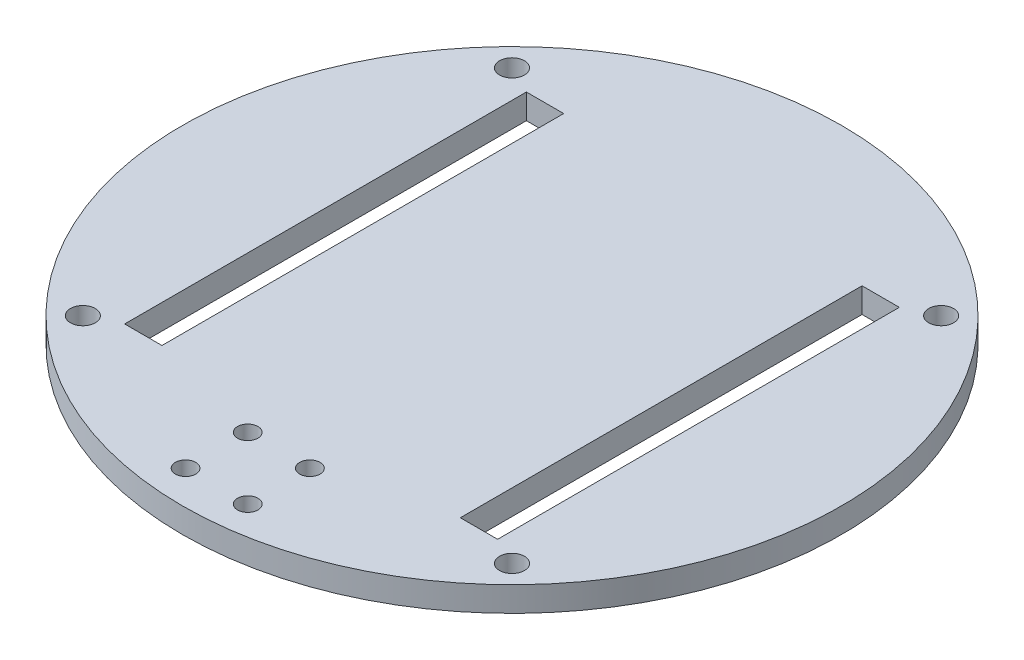
ISO-10303-21;
HEADER;
FILE_DESCRIPTION(('STEP AP214'),'2;1');
FILE_NAME('part.step','',(''),(''),'','','');
FILE_SCHEMA(('AUTOMOTIVE_DESIGN { 1 0 10303 214 1 1 1 1 }'));
ENDSEC;
DATA;
#1=APPLICATION_CONTEXT('core data for automotive mechanical design processes');
#2=APPLICATION_PROTOCOL_DEFINITION('international standard','automotive_design',2000,#1);
#3=PRODUCT_CONTEXT('',#1,'mechanical');
#4=PRODUCT('Part','Part','',(#3));
#5=PRODUCT_RELATED_PRODUCT_CATEGORY('part','',(#4));
#6=PRODUCT_DEFINITION_FORMATION('','',#4);
#7=PRODUCT_DEFINITION_CONTEXT('part definition',#1,'design');
#8=PRODUCT_DEFINITION('design','',#6,#7);
#9=PRODUCT_DEFINITION_SHAPE('','',#8);
#10=(LENGTH_UNIT() NAMED_UNIT(*) SI_UNIT(.MILLI.,.METRE.));
#11=(NAMED_UNIT(*) PLANE_ANGLE_UNIT() SI_UNIT($,.RADIAN.));
#12=(NAMED_UNIT(*) SI_UNIT($,.STERADIAN.) SOLID_ANGLE_UNIT());
#13=UNCERTAINTY_MEASURE_WITH_UNIT(LENGTH_MEASURE(1.E-05),#10,'distance_accuracy_value','');
#14=(GEOMETRIC_REPRESENTATION_CONTEXT(3) GLOBAL_UNCERTAINTY_ASSIGNED_CONTEXT((#13)) GLOBAL_UNIT_ASSIGNED_CONTEXT((#10,
#11,#12)) REPRESENTATION_CONTEXT('',''));
#15=CARTESIAN_POINT('',(0.,0.,0.));
#16=DIRECTION('',(0.,0.,1.));
#17=DIRECTION('',(1.,0.,0.));
#18=AXIS2_PLACEMENT_3D('',#15,#16,#17);
#19=CARTESIAN_POINT('',(-47.625,73.15,0.));
#20=DIRECTION('',(1.,0.,0.));
#21=DIRECTION('',(0.,0.,-1.));
#22=AXIS2_PLACEMENT_3D('',#19,#20,#21);
#23=PLANE('',#22);
#24=DIRECTION('',(0.,0.,1.));
#25=VECTOR('',#24,1.);
#26=CARTESIAN_POINT('',(-47.625,66.8,0.));
#27=LINE('',#26,#25);
#28=CARTESIAN_POINT('',(-47.625,66.8,-51.3016508018992));
#29=VERTEX_POINT('',#28);
#30=CARTESIAN_POINT('',(-47.625,66.8,51.3016508018992));
#31=VERTEX_POINT('',#30);
#32=EDGE_CURVE('E179',#29,#31,#27,.T.);
#33=ORIENTED_EDGE('',*,*,#32,.F.);
#34=DIRECTION('',(0.,-1.,0.));
#35=VECTOR('',#34,1.);
#36=CARTESIAN_POINT('',(-47.625,73.15,-51.3016508018992));
#37=LINE('',#36,#35);
#38=CARTESIAN_POINT('',(-47.625,73.15,-51.3016508018992));
#39=VERTEX_POINT('',#38);
#40=EDGE_CURVE('E11',#39,#29,#37,.T.);
#41=ORIENTED_EDGE('',*,*,#40,.F.);
#42=DIRECTION('',(0.,0.,1.));
#43=VECTOR('',#42,1.);
#44=CARTESIAN_POINT('',(-47.625,73.15,0.));
#45=LINE('',#44,#43);
#46=CARTESIAN_POINT('',(-47.625,73.15,51.3016508018992));
#47=VERTEX_POINT('',#46);
#48=EDGE_CURVE('E124',#39,#47,#45,.T.);
#49=ORIENTED_EDGE('',*,*,#48,.T.);
#50=DIRECTION('',(0.,-1.,0.));
#51=VECTOR('',#50,1.);
#52=CARTESIAN_POINT('',(-47.625,73.15,51.3016508018992));
#53=LINE('',#52,#51);
#54=EDGE_CURVE('E88',#47,#31,#53,.T.);
#55=ORIENTED_EDGE('',*,*,#54,.T.);
#56=EDGE_LOOP('',(#33,#41,#49,#55));
#57=FACE_BOUND('',#56,.T.);
#58=ADVANCED_FACE('F35',(#57),#23,.T.);
#59=CARTESIAN_POINT('',(0.,73.15,-51.3016508018992));
#60=DIRECTION('',(0.,0.,-1.));
#61=DIRECTION('',(-1.,0.,0.));
#62=AXIS2_PLACEMENT_3D('',#59,#60,#61);
#63=PLANE('',#62);
#64=DIRECTION('',(1.,0.,0.));
#65=VECTOR('',#64,1.);
#66=CARTESIAN_POINT('',(0.,66.8,-51.3016508018992));
#67=LINE('',#66,#65);
#68=CARTESIAN_POINT('',(-38.1,66.8,-51.3016508018992));
#69=VERTEX_POINT('',#68);
#70=EDGE_CURVE('E129',#29,#69,#67,.T.);
#71=ORIENTED_EDGE('',*,*,#70,.T.);
#72=DIRECTION('',(0.,-1.,0.));
#73=VECTOR('',#72,1.);
#74=CARTESIAN_POINT('',(-38.1,73.15,-51.3016508018992));
#75=LINE('',#74,#73);
#76=CARTESIAN_POINT('',(-38.1,73.15,-51.3016508018992));
#77=VERTEX_POINT('',#76);
#78=EDGE_CURVE('E45',#77,#69,#75,.T.);
#79=ORIENTED_EDGE('',*,*,#78,.F.);
#80=DIRECTION('',(1.,0.,0.));
#81=VECTOR('',#80,1.);
#82=CARTESIAN_POINT('',(0.,73.15,-51.3016508018992));
#83=LINE('',#82,#81);
#84=EDGE_CURVE('E119',#39,#77,#83,.T.);
#85=ORIENTED_EDGE('',*,*,#84,.F.);
#86=ORIENTED_EDGE('',*,*,#40,.T.);
#87=EDGE_LOOP('',(#71,#79,#85,#86));
#88=FACE_BOUND('',#87,.T.);
#89=ADVANCED_FACE('F127',(#88),#63,.F.);
#90=CARTESIAN_POINT('',(-38.1,73.15,0.));
#91=DIRECTION('',(1.,0.,0.));
#92=DIRECTION('',(0.,0.,-1.));
#93=AXIS2_PLACEMENT_3D('',#90,#91,#92);
#94=PLANE('',#93);
#95=DIRECTION('',(0.,0.,1.));
#96=VECTOR('',#95,1.);
#97=CARTESIAN_POINT('',(-38.1,66.8,0.));
#98=LINE('',#97,#96);
#99=CARTESIAN_POINT('',(-38.1,66.8,51.3016508018992));
#100=VERTEX_POINT('',#99);
#101=EDGE_CURVE('E176',#69,#100,#98,.T.);
#102=ORIENTED_EDGE('',*,*,#101,.T.);
#103=DIRECTION('',(0.,-1.,0.));
#104=VECTOR('',#103,1.);
#105=CARTESIAN_POINT('',(-38.1,73.15,51.3016508018992));
#106=LINE('',#105,#104);
#107=CARTESIAN_POINT('',(-38.1,73.15,51.3016508018992));
#108=VERTEX_POINT('',#107);
#109=EDGE_CURVE('E118',#108,#100,#106,.T.);
#110=ORIENTED_EDGE('',*,*,#109,.F.);
#111=DIRECTION('',(0.,0.,1.));
#112=VECTOR('',#111,1.);
#113=CARTESIAN_POINT('',(-38.1,73.15,0.));
#114=LINE('',#113,#112);
#115=EDGE_CURVE('E112',#77,#108,#114,.T.);
#116=ORIENTED_EDGE('',*,*,#115,.F.);
#117=ORIENTED_EDGE('',*,*,#78,.T.);
#118=EDGE_LOOP('',(#102,#110,#116,#117));
#119=FACE_BOUND('',#118,.T.);
#120=ADVANCED_FACE('F115',(#119),#94,.F.);
#121=CARTESIAN_POINT('',(0.,73.15,-51.3016508018992));
#122=DIRECTION('',(0.,0.,-1.));
#123=DIRECTION('',(-1.,0.,0.));
#124=AXIS2_PLACEMENT_3D('',#121,#122,#123);
#125=PLANE('',#124);
#126=DIRECTION('',(1.,0.,0.));
#127=VECTOR('',#126,1.);
#128=CARTESIAN_POINT('',(0.,66.8,-51.3016508018992));
#129=LINE('',#128,#127);
#130=CARTESIAN_POINT('',(38.1,66.8,-51.3016508018992));
#131=VERTEX_POINT('',#130);
#132=CARTESIAN_POINT('',(47.625,66.8,-51.3016508018992));
#133=VERTEX_POINT('',#132);
#134=EDGE_CURVE('E188',#131,#133,#129,.T.);
#135=ORIENTED_EDGE('',*,*,#134,.T.);
#136=DIRECTION('',(0.,-1.,0.));
#137=VECTOR('',#136,1.);
#138=CARTESIAN_POINT('',(47.625,73.15,-51.3016508018992));
#139=LINE('',#138,#137);
#140=CARTESIAN_POINT('',(47.625,73.15,-51.3016508018992));
#141=VERTEX_POINT('',#140);
#142=EDGE_CURVE('E39',#141,#133,#139,.T.);
#143=ORIENTED_EDGE('',*,*,#142,.F.);
#144=DIRECTION('',(1.,0.,0.));
#145=VECTOR('',#144,1.);
#146=CARTESIAN_POINT('',(0.,73.15,-51.3016508018992));
#147=LINE('',#146,#145);
#148=CARTESIAN_POINT('',(38.1,73.15,-51.3016508018992));
#149=VERTEX_POINT('',#148);
#150=EDGE_CURVE('E150',#149,#141,#147,.T.);
#151=ORIENTED_EDGE('',*,*,#150,.F.);
#152=DIRECTION('',(0.,-1.,0.));
#153=VECTOR('',#152,1.);
#154=CARTESIAN_POINT('',(38.1,73.15,-51.3016508018992));
#155=LINE('',#154,#153);
#156=EDGE_CURVE('E134',#149,#131,#155,.T.);
#157=ORIENTED_EDGE('',*,*,#156,.T.);
#158=EDGE_LOOP('',(#135,#143,#151,#157));
#159=FACE_BOUND('',#158,.T.);
#160=ADVANCED_FACE('F37',(#159),#125,.F.);
#161=CARTESIAN_POINT('',(47.625,73.15,0.));
#162=DIRECTION('',(1.,0.,0.));
#163=DIRECTION('',(0.,0.,-1.));
#164=AXIS2_PLACEMENT_3D('',#161,#162,#163);
#165=PLANE('',#164);
#166=DIRECTION('',(0.,0.,1.));
#167=VECTOR('',#166,1.);
#168=CARTESIAN_POINT('',(47.625,66.8,0.));
#169=LINE('',#168,#167);
#170=CARTESIAN_POINT('',(47.625,66.8,51.3016508018992));
#171=VERTEX_POINT('',#170);
#172=EDGE_CURVE('E186',#133,#171,#169,.T.);
#173=ORIENTED_EDGE('',*,*,#172,.T.);
#174=DIRECTION('',(0.,-1.,0.));
#175=VECTOR('',#174,1.);
#176=CARTESIAN_POINT('',(47.625,73.15,51.3016508018992));
#177=LINE('',#176,#175);
#178=CARTESIAN_POINT('',(47.625,73.15,51.3016508018992));
#179=VERTEX_POINT('',#178);
#180=EDGE_CURVE('E138',#179,#171,#177,.T.);
#181=ORIENTED_EDGE('',*,*,#180,.F.);
#182=DIRECTION('',(0.,0.,1.));
#183=VECTOR('',#182,1.);
#184=CARTESIAN_POINT('',(47.625,73.15,0.));
#185=LINE('',#184,#183);
#186=EDGE_CURVE('E96',#141,#179,#185,.T.);
#187=ORIENTED_EDGE('',*,*,#186,.F.);
#188=ORIENTED_EDGE('',*,*,#142,.T.);
#189=EDGE_LOOP('',(#173,#181,#187,#188));
#190=FACE_BOUND('',#189,.T.);
#191=ADVANCED_FACE('F238',(#190),#165,.F.);
#192=CARTESIAN_POINT('',(0.,73.15,51.3016508018992));
#193=DIRECTION('',(0.,0.,1.));
#194=DIRECTION('',(1.,0.,0.));
#195=AXIS2_PLACEMENT_3D('',#192,#193,#194);
#196=PLANE('',#195);
#197=DIRECTION('',(-1.,0.,0.));
#198=VECTOR('',#197,1.);
#199=CARTESIAN_POINT('',(0.,66.8,51.3016508018992));
#200=LINE('',#199,#198);
#201=CARTESIAN_POINT('',(38.1,66.8,51.3016508018992));
#202=VERTEX_POINT('',#201);
#203=EDGE_CURVE('E184',#171,#202,#200,.T.);
#204=ORIENTED_EDGE('',*,*,#203,.T.);
#205=DIRECTION('',(0.,-1.,0.));
#206=VECTOR('',#205,1.);
#207=CARTESIAN_POINT('',(38.1,73.15,51.3016508018992));
#208=LINE('',#207,#206);
#209=CARTESIAN_POINT('',(38.1,73.15,51.3016508018992));
#210=VERTEX_POINT('',#209);
#211=EDGE_CURVE('E136',#210,#202,#208,.T.);
#212=ORIENTED_EDGE('',*,*,#211,.F.);
#213=DIRECTION('',(-1.,0.,0.));
#214=VECTOR('',#213,1.);
#215=CARTESIAN_POINT('',(0.,73.15,51.3016508018992));
#216=LINE('',#215,#214);
#217=EDGE_CURVE('E221',#179,#210,#216,.T.);
#218=ORIENTED_EDGE('',*,*,#217,.F.);
#219=ORIENTED_EDGE('',*,*,#180,.T.);
#220=EDGE_LOOP('',(#204,#212,#218,#219));
#221=FACE_BOUND('',#220,.T.);
#222=ADVANCED_FACE('F235',(#221),#196,.F.);
#223=CARTESIAN_POINT('',(7.9375,73.15,59.5566508018992));
#224=DIRECTION('',(0.,-1.,0.));
#225=DIRECTION('',(0.,0.,-1.));
#226=AXIS2_PLACEMENT_3D('',#223,#224,#225);
#227=CYLINDRICAL_SURFACE('',#226,2.6035);
#228=CARTESIAN_POINT('',(7.9375,73.15,59.5566508018992));
#229=DIRECTION('',(0.,1.,0.));
#230=DIRECTION('',(0.,0.,1.));
#231=AXIS2_PLACEMENT_3D('',#228,#229,#230);
#232=CIRCLE('',#231,2.6035);
#233=CARTESIAN_POINT('',(7.9375,73.15,62.1601508018992));
#234=VERTEX_POINT('',#233);
#235=EDGE_CURVE('E192',#234,#234,#232,.T.);
#236=ORIENTED_EDGE('',*,*,#235,.T.);
#237=EDGE_LOOP('',(#236));
#238=FACE_BOUND('',#237,.T.);
#239=CARTESIAN_POINT('',(7.9375,66.8,59.5566508018992));
#240=DIRECTION('',(0.,1.,0.));
#241=DIRECTION('',(0.,0.,1.));
#242=AXIS2_PLACEMENT_3D('',#239,#240,#241);
#243=CIRCLE('',#242,2.6035);
#244=CARTESIAN_POINT('',(7.9375,66.8,62.1601508018992));
#245=VERTEX_POINT('',#244);
#246=EDGE_CURVE('E151',#245,#245,#243,.T.);
#247=ORIENTED_EDGE('',*,*,#246,.F.);
#248=EDGE_LOOP('',(#247));
#249=FACE_BOUND('',#248,.T.);
#250=ADVANCED_FACE('F237',(#238,#249),#227,.F.);
#251=CARTESIAN_POINT('',(-54.8007755419572,73.15,-54.8007755419577));
#252=DIRECTION('',(0.,-1.,0.));
#253=DIRECTION('',(0.,0.,-1.));
#254=AXIS2_PLACEMENT_3D('',#251,#252,#253);
#255=CYLINDRICAL_SURFACE('',#254,3.175);
#256=CARTESIAN_POINT('',(-54.8007755419572,73.15,-54.8007755419577));
#257=DIRECTION('',(0.,1.,0.));
#258=DIRECTION('',(0.,0.,1.));
#259=AXIS2_PLACEMENT_3D('',#256,#257,#258);
#260=CIRCLE('',#259,3.175);
#261=CARTESIAN_POINT('',(-54.8007755419572,73.15,-51.6257755419577));
#262=VERTEX_POINT('',#261);
#263=EDGE_CURVE('E195',#262,#262,#260,.F.);
#264=ORIENTED_EDGE('',*,*,#263,.F.);
#265=EDGE_LOOP('',(#264));
#266=FACE_BOUND('',#265,.T.);
#267=CARTESIAN_POINT('',(-54.8007755419572,66.8,-54.8007755419577));
#268=DIRECTION('',(0.,1.,0.));
#269=DIRECTION('',(0.,0.,1.));
#270=AXIS2_PLACEMENT_3D('',#267,#268,#269);
#271=CIRCLE('',#270,3.175);
#272=CARTESIAN_POINT('',(-54.8007755419572,66.8,-51.6257755419577));
#273=VERTEX_POINT('',#272);
#274=EDGE_CURVE('E154',#273,#273,#271,.F.);
#275=ORIENTED_EDGE('',*,*,#274,.T.);
#276=EDGE_LOOP('',(#275));
#277=FACE_BOUND('',#276,.T.);
#278=ADVANCED_FACE('F244',(#266,#277),#255,.F.);
#279=CARTESIAN_POINT('',(54.8007755419572,73.15,54.8007755419577));
#280=DIRECTION('',(0.,-1.,0.));
#281=DIRECTION('',(0.,0.,-1.));
#282=AXIS2_PLACEMENT_3D('',#279,#280,#281);
#283=CYLINDRICAL_SURFACE('',#282,3.17499999999999);
#284=CARTESIAN_POINT('',(54.8007755419572,73.15,54.8007755419577));
#285=DIRECTION('',(0.,1.,0.));
#286=DIRECTION('',(0.,0.,1.));
#287=AXIS2_PLACEMENT_3D('',#284,#285,#286);
#288=CIRCLE('',#287,3.17499999999999);
#289=CARTESIAN_POINT('',(54.8007755419572,73.15,57.9757755419577));
#290=VERTEX_POINT('',#289);
#291=EDGE_CURVE('E198',#290,#290,#288,.F.);
#292=ORIENTED_EDGE('',*,*,#291,.F.);
#293=EDGE_LOOP('',(#292));
#294=FACE_BOUND('',#293,.T.);
#295=CARTESIAN_POINT('',(54.8007755419572,66.8,54.8007755419577));
#296=DIRECTION('',(0.,1.,0.));
#297=DIRECTION('',(0.,0.,1.));
#298=AXIS2_PLACEMENT_3D('',#295,#296,#297);
#299=CIRCLE('',#298,3.17499999999999);
#300=CARTESIAN_POINT('',(54.8007755419572,66.8,57.9757755419577));
#301=VERTEX_POINT('',#300);
#302=EDGE_CURVE('E157',#301,#301,#299,.F.);
#303=ORIENTED_EDGE('',*,*,#302,.T.);
#304=EDGE_LOOP('',(#303));
#305=FACE_BOUND('',#304,.T.);
#306=ADVANCED_FACE('F304',(#294,#305),#283,.F.);
#307=CARTESIAN_POINT('',(0.,73.15,0.));
#308=DIRECTION('',(0.,-1.,0.));
#309=DIRECTION('',(0.,0.,-1.));
#310=AXIS2_PLACEMENT_3D('',#307,#308,#309);
#311=CYLINDRICAL_SURFACE('',#310,84.1675);
#312=CARTESIAN_POINT('',(0.,73.15,0.));
#313=DIRECTION('',(0.,1.,0.));
#314=DIRECTION('',(0.,0.,1.));
#315=AXIS2_PLACEMENT_3D('',#312,#313,#314);
#316=CIRCLE('',#315,84.1675);
#317=CARTESIAN_POINT('',(0.,73.15,84.1675));
#318=VERTEX_POINT('',#317);
#319=EDGE_CURVE('E201',#318,#318,#316,.T.);
#320=ORIENTED_EDGE('',*,*,#319,.F.);
#321=EDGE_LOOP('',(#320));
#322=FACE_BOUND('',#321,.T.);
#323=CARTESIAN_POINT('',(0.,66.8,0.));
#324=DIRECTION('',(0.,1.,0.));
#325=DIRECTION('',(0.,0.,1.));
#326=AXIS2_PLACEMENT_3D('',#323,#324,#325);
#327=CIRCLE('',#326,84.1675);
#328=CARTESIAN_POINT('',(0.,66.8,84.1675));
#329=VERTEX_POINT('',#328);
#330=EDGE_CURVE('E160',#329,#329,#327,.T.);
#331=ORIENTED_EDGE('',*,*,#330,.T.);
#332=EDGE_LOOP('',(#331));
#333=FACE_BOUND('',#332,.T.);
#334=ADVANCED_FACE('F315',(#322,#333),#311,.T.);
#335=CARTESIAN_POINT('',(54.8007755419577,73.15,-54.8007755419572));
#336=DIRECTION('',(0.,-1.,0.));
#337=DIRECTION('',(0.,0.,-1.));
#338=AXIS2_PLACEMENT_3D('',#335,#336,#337);
#339=CYLINDRICAL_SURFACE('',#338,3.175);
#340=CARTESIAN_POINT('',(54.8007755419577,73.15,-54.8007755419572));
#341=DIRECTION('',(0.,1.,0.));
#342=DIRECTION('',(0.,0.,1.));
#343=AXIS2_PLACEMENT_3D('',#340,#341,#342);
#344=CIRCLE('',#343,3.175);
#345=CARTESIAN_POINT('',(54.8007755419577,73.15,-51.6257755419572));
#346=VERTEX_POINT('',#345);
#347=EDGE_CURVE('E204',#346,#346,#344,.F.);
#348=ORIENTED_EDGE('',*,*,#347,.F.);
#349=EDGE_LOOP('',(#348));
#350=FACE_BOUND('',#349,.T.);
#351=CARTESIAN_POINT('',(54.8007755419577,66.8,-54.8007755419572));
#352=DIRECTION('',(0.,1.,0.));
#353=DIRECTION('',(0.,0.,1.));
#354=AXIS2_PLACEMENT_3D('',#351,#352,#353);
#355=CIRCLE('',#354,3.175);
#356=CARTESIAN_POINT('',(54.8007755419577,66.8,-51.6257755419572));
#357=VERTEX_POINT('',#356);
#358=EDGE_CURVE('E163',#357,#357,#355,.F.);
#359=ORIENTED_EDGE('',*,*,#358,.T.);
#360=EDGE_LOOP('',(#359));
#361=FACE_BOUND('',#360,.T.);
#362=ADVANCED_FACE('F326',(#350,#361),#339,.F.);
#363=CARTESIAN_POINT('',(-54.8007755419577,73.15,54.8007755419572));
#364=DIRECTION('',(0.,-1.,0.));
#365=DIRECTION('',(0.,0.,-1.));
#366=AXIS2_PLACEMENT_3D('',#363,#364,#365);
#367=CYLINDRICAL_SURFACE('',#366,3.175);
#368=CARTESIAN_POINT('',(-54.8007755419577,73.15,54.8007755419572));
#369=DIRECTION('',(0.,1.,0.));
#370=DIRECTION('',(0.,0.,1.));
#371=AXIS2_PLACEMENT_3D('',#368,#369,#370);
#372=CIRCLE('',#371,3.175);
#373=CARTESIAN_POINT('',(-54.8007755419577,73.15,57.9757755419572));
#374=VERTEX_POINT('',#373);
#375=EDGE_CURVE('E207',#374,#374,#372,.F.);
#376=ORIENTED_EDGE('',*,*,#375,.F.);
#377=EDGE_LOOP('',(#376));
#378=FACE_BOUND('',#377,.T.);
#379=CARTESIAN_POINT('',(-54.8007755419577,66.8,54.8007755419572));
#380=DIRECTION('',(0.,1.,0.));
#381=DIRECTION('',(0.,0.,1.));
#382=AXIS2_PLACEMENT_3D('',#379,#380,#381);
#383=CIRCLE('',#382,3.175);
#384=CARTESIAN_POINT('',(-54.8007755419577,66.8,57.9757755419572));
#385=VERTEX_POINT('',#384);
#386=EDGE_CURVE('E166',#385,#385,#383,.F.);
#387=ORIENTED_EDGE('',*,*,#386,.T.);
#388=EDGE_LOOP('',(#387));
#389=FACE_BOUND('',#388,.T.);
#390=ADVANCED_FACE('F337',(#378,#389),#367,.F.);
#391=CARTESIAN_POINT('',(7.9375,73.15,75.4316508018992));
#392=DIRECTION('',(0.,-1.,0.));
#393=DIRECTION('',(0.,0.,-1.));
#394=AXIS2_PLACEMENT_3D('',#391,#392,#393);
#395=CYLINDRICAL_SURFACE('',#394,2.6035);
#396=CARTESIAN_POINT('',(7.9375,73.15,75.4316508018992));
#397=DIRECTION('',(0.,1.,0.));
#398=DIRECTION('',(0.,0.,1.));
#399=AXIS2_PLACEMENT_3D('',#396,#397,#398);
#400=CIRCLE('',#399,2.6035);
#401=CARTESIAN_POINT('',(7.9375,73.15,78.0351508018992));
#402=VERTEX_POINT('',#401);
#403=EDGE_CURVE('E210',#402,#402,#400,.T.);
#404=ORIENTED_EDGE('',*,*,#403,.T.);
#405=EDGE_LOOP('',(#404));
#406=FACE_BOUND('',#405,.T.);
#407=CARTESIAN_POINT('',(7.9375,66.8,75.4316508018992));
#408=DIRECTION('',(0.,1.,0.));
#409=DIRECTION('',(0.,0.,1.));
#410=AXIS2_PLACEMENT_3D('',#407,#408,#409);
#411=CIRCLE('',#410,2.6035);
#412=CARTESIAN_POINT('',(7.9375,66.8,78.0351508018992));
#413=VERTEX_POINT('',#412);
#414=EDGE_CURVE('E169',#413,#413,#411,.T.);
#415=ORIENTED_EDGE('',*,*,#414,.F.);
#416=EDGE_LOOP('',(#415));
#417=FACE_BOUND('',#416,.T.);
#418=ADVANCED_FACE('F270',(#406,#417),#395,.F.);
#419=CARTESIAN_POINT('',(-7.9375,73.15,75.4316508018992));
#420=DIRECTION('',(0.,-1.,0.));
#421=DIRECTION('',(0.,0.,-1.));
#422=AXIS2_PLACEMENT_3D('',#419,#420,#421);
#423=CYLINDRICAL_SURFACE('',#422,2.6035);
#424=CARTESIAN_POINT('',(-7.9375,73.15,75.4316508018992));
#425=DIRECTION('',(0.,1.,0.));
#426=DIRECTION('',(0.,0.,1.));
#427=AXIS2_PLACEMENT_3D('',#424,#425,#426);
#428=CIRCLE('',#427,2.6035);
#429=CARTESIAN_POINT('',(-7.9375,73.15,78.0351508018992));
#430=VERTEX_POINT('',#429);
#431=EDGE_CURVE('E213',#430,#430,#428,.T.);
#432=ORIENTED_EDGE('',*,*,#431,.T.);
#433=EDGE_LOOP('',(#432));
#434=FACE_BOUND('',#433,.T.);
#435=CARTESIAN_POINT('',(-7.9375,66.8,75.4316508018992));
#436=DIRECTION('',(0.,1.,0.));
#437=DIRECTION('',(0.,0.,1.));
#438=AXIS2_PLACEMENT_3D('',#435,#436,#437);
#439=CIRCLE('',#438,2.6035);
#440=CARTESIAN_POINT('',(-7.9375,66.8,78.0351508018992));
#441=VERTEX_POINT('',#440);
#442=EDGE_CURVE('E172',#441,#441,#439,.T.);
#443=ORIENTED_EDGE('',*,*,#442,.F.);
#444=EDGE_LOOP('',(#443));
#445=FACE_BOUND('',#444,.T.);
#446=ADVANCED_FACE('F264',(#434,#445),#423,.F.);
#447=CARTESIAN_POINT('',(0.,73.15,51.3016508018992));
#448=DIRECTION('',(0.,0.,1.));
#449=DIRECTION('',(1.,0.,0.));
#450=AXIS2_PLACEMENT_3D('',#447,#448,#449);
#451=PLANE('',#450);
#452=DIRECTION('',(-1.,0.,0.));
#453=VECTOR('',#452,1.);
#454=CARTESIAN_POINT('',(0.,66.8,51.3016508018992));
#455=LINE('',#454,#453);
#456=EDGE_CURVE('E81',#100,#31,#455,.T.);
#457=ORIENTED_EDGE('',*,*,#456,.T.);
#458=ORIENTED_EDGE('',*,*,#54,.F.);
#459=DIRECTION('',(-1.,0.,0.));
#460=VECTOR('',#459,1.);
#461=CARTESIAN_POINT('',(0.,73.15,51.3016508018992));
#462=LINE('',#461,#460);
#463=EDGE_CURVE('E54',#108,#47,#462,.T.);
#464=ORIENTED_EDGE('',*,*,#463,.F.);
#465=ORIENTED_EDGE('',*,*,#109,.T.);
#466=EDGE_LOOP('',(#457,#458,#464,#465));
#467=FACE_BOUND('',#466,.T.);
#468=ADVANCED_FACE('F257',(#467),#451,.F.);
#469=CARTESIAN_POINT('',(38.1,73.15,0.));
#470=DIRECTION('',(1.,0.,0.));
#471=DIRECTION('',(0.,0.,-1.));
#472=AXIS2_PLACEMENT_3D('',#469,#470,#471);
#473=PLANE('',#472);
#474=DIRECTION('',(0.,0.,1.));
#475=VECTOR('',#474,1.);
#476=CARTESIAN_POINT('',(38.1,66.8,0.));
#477=LINE('',#476,#475);
#478=EDGE_CURVE('E181',#131,#202,#477,.T.);
#479=ORIENTED_EDGE('',*,*,#478,.F.);
#480=ORIENTED_EDGE('',*,*,#156,.F.);
#481=DIRECTION('',(0.,0.,1.));
#482=VECTOR('',#481,1.);
#483=CARTESIAN_POINT('',(38.1,73.15,0.));
#484=LINE('',#483,#482);
#485=EDGE_CURVE('E218',#149,#210,#484,.T.);
#486=ORIENTED_EDGE('',*,*,#485,.T.);
#487=ORIENTED_EDGE('',*,*,#211,.T.);
#488=EDGE_LOOP('',(#479,#480,#486,#487));
#489=FACE_BOUND('',#488,.T.);
#490=ADVANCED_FACE('F233',(#489),#473,.T.);
#491=CARTESIAN_POINT('',(-7.9375,73.15,59.5566508018992));
#492=DIRECTION('',(0.,-1.,0.));
#493=DIRECTION('',(0.,0.,-1.));
#494=AXIS2_PLACEMENT_3D('',#491,#492,#493);
#495=CYLINDRICAL_SURFACE('',#494,2.6035);
#496=CARTESIAN_POINT('',(-7.9375,73.15,59.5566508018992));
#497=DIRECTION('',(0.,1.,0.));
#498=DIRECTION('',(0.,0.,1.));
#499=AXIS2_PLACEMENT_3D('',#496,#497,#498);
#500=CIRCLE('',#499,2.6035);
#501=CARTESIAN_POINT('',(-7.9375,73.15,62.1601508018992));
#502=VERTEX_POINT('',#501);
#503=EDGE_CURVE('E137',#502,#502,#500,.T.);
#504=ORIENTED_EDGE('',*,*,#503,.T.);
#505=EDGE_LOOP('',(#504));
#506=FACE_BOUND('',#505,.T.);
#507=CARTESIAN_POINT('',(-7.9375,66.8,59.5566508018992));
#508=DIRECTION('',(0.,1.,0.));
#509=DIRECTION('',(0.,0.,1.));
#510=AXIS2_PLACEMENT_3D('',#507,#508,#509);
#511=CIRCLE('',#510,2.6035);
#512=CARTESIAN_POINT('',(-7.9375,66.8,62.1601508018992));
#513=VERTEX_POINT('',#512);
#514=EDGE_CURVE('E147',#513,#513,#511,.T.);
#515=ORIENTED_EDGE('',*,*,#514,.F.);
#516=EDGE_LOOP('',(#515));
#517=FACE_BOUND('',#516,.T.);
#518=ADVANCED_FACE('F256',(#506,#517),#495,.F.);
#519=CARTESIAN_POINT('',(0.,73.15,0.));
#520=DIRECTION('',(0.,1.,0.));
#521=DIRECTION('',(0.,0.,1.));
#522=AXIS2_PLACEMENT_3D('',#519,#520,#521);
#523=PLANE('',#522);
#524=ORIENTED_EDGE('',*,*,#150,.T.);
#525=ORIENTED_EDGE('',*,*,#186,.T.);
#526=ORIENTED_EDGE('',*,*,#217,.T.);
#527=ORIENTED_EDGE('',*,*,#485,.F.);
#528=EDGE_LOOP('',(#524,#525,#526,#527));
#529=FACE_BOUND('',#528,.T.);
#530=ORIENTED_EDGE('',*,*,#48,.F.);
#531=ORIENTED_EDGE('',*,*,#84,.T.);
#532=ORIENTED_EDGE('',*,*,#115,.T.);
#533=ORIENTED_EDGE('',*,*,#463,.T.);
#534=EDGE_LOOP('',(#530,#531,#532,#533));
#535=FACE_BOUND('',#534,.T.);
#536=ORIENTED_EDGE('',*,*,#431,.F.);
#537=EDGE_LOOP('',(#536));
#538=FACE_BOUND('',#537,.T.);
#539=ORIENTED_EDGE('',*,*,#403,.F.);
#540=EDGE_LOOP('',(#539));
#541=FACE_BOUND('',#540,.T.);
#542=ORIENTED_EDGE('',*,*,#375,.T.);
#543=EDGE_LOOP('',(#542));
#544=FACE_BOUND('',#543,.T.);
#545=ORIENTED_EDGE('',*,*,#347,.T.);
#546=EDGE_LOOP('',(#545));
#547=FACE_BOUND('',#546,.T.);
#548=ORIENTED_EDGE('',*,*,#319,.T.);
#549=EDGE_LOOP('',(#548));
#550=FACE_BOUND('',#549,.T.);
#551=ORIENTED_EDGE('',*,*,#291,.T.);
#552=EDGE_LOOP('',(#551));
#553=FACE_BOUND('',#552,.T.);
#554=ORIENTED_EDGE('',*,*,#263,.T.);
#555=EDGE_LOOP('',(#554));
#556=FACE_BOUND('',#555,.T.);
#557=ORIENTED_EDGE('',*,*,#235,.F.);
#558=EDGE_LOOP('',(#557));
#559=FACE_BOUND('',#558,.T.);
#560=ORIENTED_EDGE('',*,*,#503,.F.);
#561=EDGE_LOOP('',(#560));
#562=FACE_BOUND('',#561,.T.);
#563=ADVANCED_FACE('F122',(#529,#535,#538,#541,#544,#547,#550,#553,#556,#559,#562),#523,.T.);
#564=CARTESIAN_POINT('',(0.,66.8,0.));
#565=DIRECTION('',(0.,1.,0.));
#566=DIRECTION('',(0.,0.,1.));
#567=AXIS2_PLACEMENT_3D('',#564,#565,#566);
#568=PLANE('',#567);
#569=ORIENTED_EDGE('',*,*,#134,.F.);
#570=ORIENTED_EDGE('',*,*,#478,.T.);
#571=ORIENTED_EDGE('',*,*,#203,.F.);
#572=ORIENTED_EDGE('',*,*,#172,.F.);
#573=EDGE_LOOP('',(#569,#570,#571,#572));
#574=FACE_BOUND('',#573,.T.);
#575=ORIENTED_EDGE('',*,*,#32,.T.);
#576=ORIENTED_EDGE('',*,*,#456,.F.);
#577=ORIENTED_EDGE('',*,*,#101,.F.);
#578=ORIENTED_EDGE('',*,*,#70,.F.);
#579=EDGE_LOOP('',(#575,#576,#577,#578));
#580=FACE_BOUND('',#579,.T.);
#581=ORIENTED_EDGE('',*,*,#442,.T.);
#582=EDGE_LOOP('',(#581));
#583=FACE_BOUND('',#582,.T.);
#584=ORIENTED_EDGE('',*,*,#414,.T.);
#585=EDGE_LOOP('',(#584));
#586=FACE_BOUND('',#585,.T.);
#587=ORIENTED_EDGE('',*,*,#386,.F.);
#588=EDGE_LOOP('',(#587));
#589=FACE_BOUND('',#588,.T.);
#590=ORIENTED_EDGE('',*,*,#358,.F.);
#591=EDGE_LOOP('',(#590));
#592=FACE_BOUND('',#591,.T.);
#593=ORIENTED_EDGE('',*,*,#330,.F.);
#594=EDGE_LOOP('',(#593));
#595=FACE_BOUND('',#594,.T.);
#596=ORIENTED_EDGE('',*,*,#302,.F.);
#597=EDGE_LOOP('',(#596));
#598=FACE_BOUND('',#597,.T.);
#599=ORIENTED_EDGE('',*,*,#274,.F.);
#600=EDGE_LOOP('',(#599));
#601=FACE_BOUND('',#600,.T.);
#602=ORIENTED_EDGE('',*,*,#246,.T.);
#603=EDGE_LOOP('',(#602));
#604=FACE_BOUND('',#603,.T.);
#605=ORIENTED_EDGE('',*,*,#514,.T.);
#606=EDGE_LOOP('',(#605));
#607=FACE_BOUND('',#606,.T.);
#608=ADVANCED_FACE('F231',(#574,#580,#583,#586,#589,#592,#595,#598,#601,#604,#607),#568,.F.);
#609=CLOSED_SHELL('',(#58,#89,#120,#160,#191,#222,#250,#278,#306,#334,#362,#390,#418,#446,#468,
#490,#518,#563,#608));
#610=MANIFOLD_SOLID_BREP('B2',#609);
#611=ADVANCED_BREP_SHAPE_REPRESENTATION('',(#18,#610),#14);
#612=SHAPE_DEFINITION_REPRESENTATION(#9,#611);
ENDSEC;
END-ISO-10303-21;
